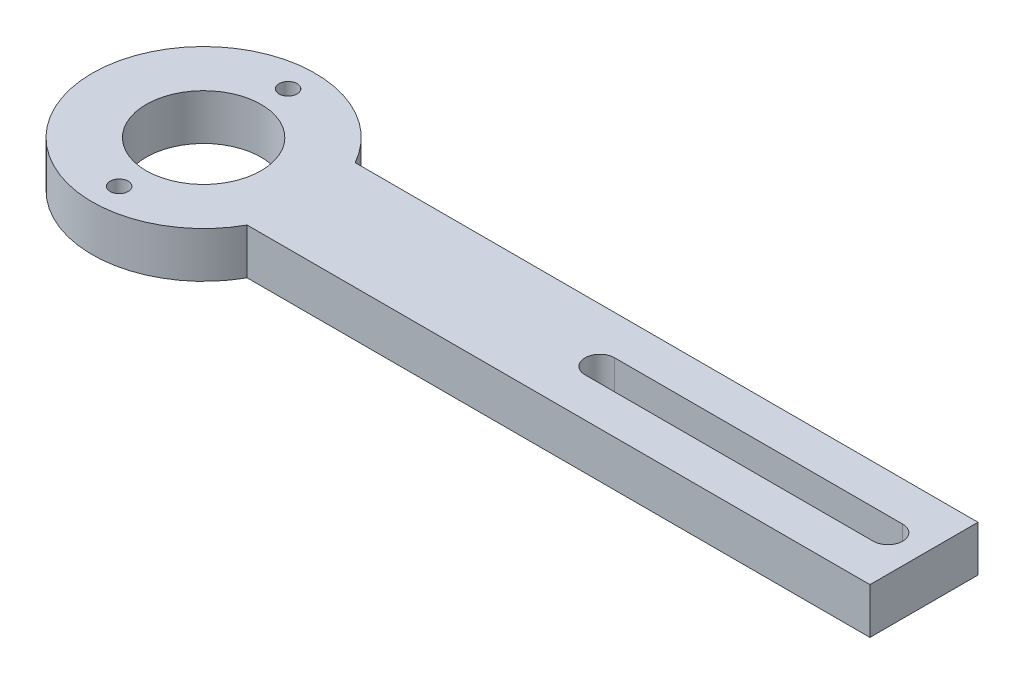
ISO-10303-21;
HEADER;
FILE_DESCRIPTION(('STEP AP214'),'2;1');
FILE_NAME('part.step','',(''),(''),'','','');
FILE_SCHEMA(('AUTOMOTIVE_DESIGN { 1 0 10303 214 1 1 1 1 }'));
ENDSEC;
DATA;
#1=APPLICATION_CONTEXT('core data for automotive mechanical design processes');
#2=APPLICATION_PROTOCOL_DEFINITION('international standard','automotive_design',2000,#1);
#3=PRODUCT_CONTEXT('',#1,'mechanical');
#4=PRODUCT('Part','Part','',(#3));
#5=PRODUCT_RELATED_PRODUCT_CATEGORY('part','',(#4));
#6=PRODUCT_DEFINITION_FORMATION('','',#4);
#7=PRODUCT_DEFINITION_CONTEXT('part definition',#1,'design');
#8=PRODUCT_DEFINITION('design','',#6,#7);
#9=PRODUCT_DEFINITION_SHAPE('','',#8);
#10=(LENGTH_UNIT() NAMED_UNIT(*) SI_UNIT(.MILLI.,.METRE.));
#11=(NAMED_UNIT(*) PLANE_ANGLE_UNIT() SI_UNIT($,.RADIAN.));
#12=(NAMED_UNIT(*) SI_UNIT($,.STERADIAN.) SOLID_ANGLE_UNIT());
#13=UNCERTAINTY_MEASURE_WITH_UNIT(LENGTH_MEASURE(1.E-05),#10,'distance_accuracy_value','');
#14=(GEOMETRIC_REPRESENTATION_CONTEXT(3) GLOBAL_UNCERTAINTY_ASSIGNED_CONTEXT((#13)) GLOBAL_UNIT_ASSIGNED_CONTEXT((#10,
#11,#12)) REPRESENTATION_CONTEXT('',''));
#15=CARTESIAN_POINT('',(0.,0.,0.));
#16=DIRECTION('',(0.,0.,1.));
#17=DIRECTION('',(1.,0.,0.));
#18=AXIS2_PLACEMENT_3D('',#15,#16,#17);
#19=CARTESIAN_POINT('',(0.,6.35,0.));
#20=DIRECTION('',(0.,1.,0.));
#21=DIRECTION('',(0.,0.,1.));
#22=AXIS2_PLACEMENT_3D('',#19,#20,#21);
#23=PLANE('',#22);
#24=CARTESIAN_POINT('',(0.,6.35,11.725));
#25=DIRECTION('',(0.,1.,0.));
#26=DIRECTION('',(0.,0.,1.));
#27=AXIS2_PLACEMENT_3D('',#24,#25,#26);
#28=CIRCLE('',#27,1.25);
#29=CARTESIAN_POINT('',(0.,6.35,12.975));
#30=VERTEX_POINT('',#29);
#31=EDGE_CURVE('E127',#30,#30,#28,.T.);
#32=ORIENTED_EDGE('',*,*,#31,.F.);
#33=EDGE_LOOP('',(#32));
#34=FACE_BOUND('',#33,.T.);
#35=CARTESIAN_POINT('',(0.,6.35,0.));
#36=DIRECTION('',(0.,1.,0.));
#37=DIRECTION('',(0.,0.,1.));
#38=AXIS2_PLACEMENT_3D('',#35,#36,#37);
#39=CIRCLE('',#38,15.475);
#40=CARTESIAN_POINT('',(13.5360860295729,6.35,-7.5));
#41=VERTEX_POINT('',#40);
#42=CARTESIAN_POINT('',(13.5360860295729,6.35,7.5));
#43=VERTEX_POINT('',#42);
#44=EDGE_CURVE('E143',#41,#43,#39,.T.);
#45=ORIENTED_EDGE('',*,*,#44,.T.);
#46=DIRECTION('',(1.,0.,0.));
#47=VECTOR('',#46,1.);
#48=CARTESIAN_POINT('',(100.,6.35,7.5));
#49=LINE('',#48,#47);
#50=CARTESIAN_POINT('',(100.,6.35,7.5));
#51=VERTEX_POINT('',#50);
#52=EDGE_CURVE('E146',#43,#51,#49,.T.);
#53=ORIENTED_EDGE('',*,*,#52,.T.);
#54=DIRECTION('',(0.,0.,-1.));
#55=VECTOR('',#54,1.);
#56=CARTESIAN_POINT('',(100.,6.35,-7.5));
#57=LINE('',#56,#55);
#58=CARTESIAN_POINT('',(100.,6.35,-7.5));
#59=VERTEX_POINT('',#58);
#60=EDGE_CURVE('E149',#51,#59,#57,.T.);
#61=ORIENTED_EDGE('',*,*,#60,.T.);
#62=DIRECTION('',(-1.,0.,0.));
#63=VECTOR('',#62,1.);
#64=CARTESIAN_POINT('',(13.5360860295729,6.35,-7.5));
#65=LINE('',#64,#63);
#66=EDGE_CURVE('E151',#59,#41,#65,.T.);
#67=ORIENTED_EDGE('',*,*,#66,.T.);
#68=EDGE_LOOP('',(#45,#53,#61,#67));
#69=FACE_BOUND('',#68,.T.);
#70=CARTESIAN_POINT('',(0.,6.35,0.));
#71=DIRECTION('',(0.,1.,0.));
#72=DIRECTION('',(0.,0.,1.));
#73=AXIS2_PLACEMENT_3D('',#70,#71,#72);
#74=CIRCLE('',#73,7.975);
#75=CARTESIAN_POINT('',(0.,6.35,7.975));
#76=VERTEX_POINT('',#75);
#77=EDGE_CURVE('E137',#76,#76,#74,.T.);
#78=ORIENTED_EDGE('',*,*,#77,.F.);
#79=EDGE_LOOP('',(#78));
#80=FACE_BOUND('',#79,.T.);
#81=DIRECTION('',(1.,0.,0.));
#82=VECTOR('',#81,1.);
#83=CARTESIAN_POINT('',(55.,6.35,2.05));
#84=LINE('',#83,#82);
#85=CARTESIAN_POINT('',(55.,6.35,2.05));
#86=VERTEX_POINT('',#85);
#87=CARTESIAN_POINT('',(95.,6.35,2.05));
#88=VERTEX_POINT('',#87);
#89=EDGE_CURVE('E106',#86,#88,#84,.T.);
#90=ORIENTED_EDGE('',*,*,#89,.F.);
#91=CARTESIAN_POINT('',(55.,6.35,0.));
#92=DIRECTION('',(0.,1.,0.));
#93=DIRECTION('',(0.,0.,1.));
#94=AXIS2_PLACEMENT_3D('',#91,#92,#93);
#95=CIRCLE('',#94,2.05);
#96=CARTESIAN_POINT('',(55.,6.35,-2.05));
#97=VERTEX_POINT('',#96);
#98=EDGE_CURVE('E98',#97,#86,#95,.T.);
#99=ORIENTED_EDGE('',*,*,#98,.F.);
#100=DIRECTION('',(-1.,0.,0.));
#101=VECTOR('',#100,1.);
#102=CARTESIAN_POINT('',(55.,6.35,-2.05));
#103=LINE('',#102,#101);
#104=CARTESIAN_POINT('',(95.,6.35,-2.05));
#105=VERTEX_POINT('',#104);
#106=EDGE_CURVE('E121',#105,#97,#103,.T.);
#107=ORIENTED_EDGE('',*,*,#106,.F.);
#108=CARTESIAN_POINT('',(95.,6.35,0.));
#109=DIRECTION('',(0.,1.,0.));
#110=DIRECTION('',(0.,0.,1.));
#111=AXIS2_PLACEMENT_3D('',#108,#109,#110);
#112=CIRCLE('',#111,2.05);
#113=EDGE_CURVE('E119',#88,#105,#112,.T.);
#114=ORIENTED_EDGE('',*,*,#113,.F.);
#115=EDGE_LOOP('',(#90,#99,#107,#114));
#116=FACE_BOUND('',#115,.T.);
#117=CARTESIAN_POINT('',(0.,6.35,-11.725));
#118=DIRECTION('',(0.,1.,0.));
#119=DIRECTION('',(0.,0.,1.));
#120=AXIS2_PLACEMENT_3D('',#117,#118,#119);
#121=CIRCLE('',#120,1.25);
#122=CARTESIAN_POINT('',(0.,6.35,-10.475));
#123=VERTEX_POINT('',#122);
#124=EDGE_CURVE('E242',#123,#123,#121,.T.);
#125=ORIENTED_EDGE('',*,*,#124,.F.);
#126=EDGE_LOOP('',(#125));
#127=FACE_BOUND('',#126,.T.);
#128=ADVANCED_FACE('F33',(#34,#69,#80,#116,#127),#23,.T.);
#129=CARTESIAN_POINT('',(0.,0.,0.));
#130=DIRECTION('',(0.,1.,0.));
#131=DIRECTION('',(0.,0.,1.));
#132=AXIS2_PLACEMENT_3D('',#129,#130,#131);
#133=PLANE('',#132);
#134=CARTESIAN_POINT('',(0.,0.,0.));
#135=DIRECTION('',(0.,1.,0.));
#136=DIRECTION('',(0.,0.,1.));
#137=AXIS2_PLACEMENT_3D('',#134,#135,#136);
#138=CIRCLE('',#137,7.975);
#139=CARTESIAN_POINT('',(0.,0.,7.975));
#140=VERTEX_POINT('',#139);
#141=EDGE_CURVE('E114',#140,#140,#138,.T.);
#142=ORIENTED_EDGE('',*,*,#141,.T.);
#143=EDGE_LOOP('',(#142));
#144=FACE_BOUND('',#143,.T.);
#145=CARTESIAN_POINT('',(0.,0.,0.));
#146=DIRECTION('',(0.,1.,0.));
#147=DIRECTION('',(0.,0.,1.));
#148=AXIS2_PLACEMENT_3D('',#145,#146,#147);
#149=CIRCLE('',#148,15.475);
#150=CARTESIAN_POINT('',(13.5360860295729,0.,-7.5));
#151=VERTEX_POINT('',#150);
#152=CARTESIAN_POINT('',(13.5360860295729,0.,7.5));
#153=VERTEX_POINT('',#152);
#154=EDGE_CURVE('E140',#151,#153,#149,.T.);
#155=ORIENTED_EDGE('',*,*,#154,.F.);
#156=DIRECTION('',(-1.,0.,0.));
#157=VECTOR('',#156,1.);
#158=CARTESIAN_POINT('',(13.5360860295729,0.,-7.5));
#159=LINE('',#158,#157);
#160=CARTESIAN_POINT('',(100.,0.,-7.5));
#161=VERTEX_POINT('',#160);
#162=EDGE_CURVE('E147',#161,#151,#159,.T.);
#163=ORIENTED_EDGE('',*,*,#162,.F.);
#164=DIRECTION('',(0.,0.,-1.));
#165=VECTOR('',#164,1.);
#166=CARTESIAN_POINT('',(100.,0.,-7.5));
#167=LINE('',#166,#165);
#168=CARTESIAN_POINT('',(100.,0.,7.5));
#169=VERTEX_POINT('',#168);
#170=EDGE_CURVE('E158',#169,#161,#167,.T.);
#171=ORIENTED_EDGE('',*,*,#170,.F.);
#172=DIRECTION('',(1.,0.,0.));
#173=VECTOR('',#172,1.);
#174=CARTESIAN_POINT('',(100.,0.,7.5));
#175=LINE('',#174,#173);
#176=EDGE_CURVE('E156',#153,#169,#175,.T.);
#177=ORIENTED_EDGE('',*,*,#176,.F.);
#178=EDGE_LOOP('',(#155,#163,#171,#177));
#179=FACE_BOUND('',#178,.T.);
#180=CARTESIAN_POINT('',(55.,0.,0.));
#181=DIRECTION('',(0.,1.,0.));
#182=DIRECTION('',(0.,0.,1.));
#183=AXIS2_PLACEMENT_3D('',#180,#181,#182);
#184=CIRCLE('',#183,2.05);
#185=CARTESIAN_POINT('',(55.,0.,-2.05));
#186=VERTEX_POINT('',#185);
#187=CARTESIAN_POINT('',(55.,0.,2.05));
#188=VERTEX_POINT('',#187);
#189=EDGE_CURVE('E56',#186,#188,#184,.T.);
#190=ORIENTED_EDGE('',*,*,#189,.T.);
#191=DIRECTION('',(1.,0.,0.));
#192=VECTOR('',#191,1.);
#193=CARTESIAN_POINT('',(55.,0.,2.05));
#194=LINE('',#193,#192);
#195=CARTESIAN_POINT('',(95.,0.,2.05));
#196=VERTEX_POINT('',#195);
#197=EDGE_CURVE('E113',#188,#196,#194,.T.);
#198=ORIENTED_EDGE('',*,*,#197,.T.);
#199=CARTESIAN_POINT('',(95.,0.,0.));
#200=DIRECTION('',(0.,1.,0.));
#201=DIRECTION('',(0.,0.,1.));
#202=AXIS2_PLACEMENT_3D('',#199,#200,#201);
#203=CIRCLE('',#202,2.05);
#204=CARTESIAN_POINT('',(95.,0.,-2.05));
#205=VERTEX_POINT('',#204);
#206=EDGE_CURVE('E129',#196,#205,#203,.T.);
#207=ORIENTED_EDGE('',*,*,#206,.T.);
#208=DIRECTION('',(-1.,0.,0.));
#209=VECTOR('',#208,1.);
#210=CARTESIAN_POINT('',(55.,0.,-2.05));
#211=LINE('',#210,#209);
#212=EDGE_CURVE('E107',#205,#186,#211,.T.);
#213=ORIENTED_EDGE('',*,*,#212,.T.);
#214=EDGE_LOOP('',(#190,#198,#207,#213));
#215=FACE_BOUND('',#214,.T.);
#216=CARTESIAN_POINT('',(0.,0.,11.725));
#217=DIRECTION('',(0.,1.,0.));
#218=DIRECTION('',(0.,0.,1.));
#219=AXIS2_PLACEMENT_3D('',#216,#217,#218);
#220=CIRCLE('',#219,1.25);
#221=CARTESIAN_POINT('',(0.,0.,12.975));
#222=VERTEX_POINT('',#221);
#223=EDGE_CURVE('E248',#222,#222,#220,.T.);
#224=ORIENTED_EDGE('',*,*,#223,.T.);
#225=EDGE_LOOP('',(#224));
#226=FACE_BOUND('',#225,.T.);
#227=CARTESIAN_POINT('',(0.,0.,-11.725));
#228=DIRECTION('',(0.,1.,0.));
#229=DIRECTION('',(0.,0.,1.));
#230=AXIS2_PLACEMENT_3D('',#227,#228,#229);
#231=CIRCLE('',#230,1.25);
#232=CARTESIAN_POINT('',(0.,0.,-10.475));
#233=VERTEX_POINT('',#232);
#234=EDGE_CURVE('E245',#233,#233,#231,.T.);
#235=ORIENTED_EDGE('',*,*,#234,.T.);
#236=EDGE_LOOP('',(#235));
#237=FACE_BOUND('',#236,.T.);
#238=ADVANCED_FACE('F176',(#144,#179,#215,#226,#237),#133,.F.);
#239=CARTESIAN_POINT('',(0.,6.35,0.));
#240=DIRECTION('',(0.,-1.,0.));
#241=DIRECTION('',(0.,0.,-1.));
#242=AXIS2_PLACEMENT_3D('',#239,#240,#241);
#243=CYLINDRICAL_SURFACE('',#242,15.475);
#244=ORIENTED_EDGE('',*,*,#154,.T.);
#245=DIRECTION('',(0.,-1.,0.));
#246=VECTOR('',#245,1.);
#247=CARTESIAN_POINT('',(13.5360860295729,6.35,7.5));
#248=LINE('',#247,#246);
#249=EDGE_CURVE('E11',#43,#153,#248,.T.);
#250=ORIENTED_EDGE('',*,*,#249,.F.);
#251=ORIENTED_EDGE('',*,*,#44,.F.);
#252=DIRECTION('',(0.,-1.,0.));
#253=VECTOR('',#252,1.);
#254=CARTESIAN_POINT('',(13.5360860295729,6.35,-7.5));
#255=LINE('',#254,#253);
#256=EDGE_CURVE('E153',#41,#151,#255,.T.);
#257=ORIENTED_EDGE('',*,*,#256,.T.);
#258=EDGE_LOOP('',(#244,#250,#251,#257));
#259=FACE_BOUND('',#258,.T.);
#260=ADVANCED_FACE('F35',(#259),#243,.T.);
#261=CARTESIAN_POINT('',(100.,6.35,7.5));
#262=DIRECTION('',(0.,0.,-1.));
#263=DIRECTION('',(-1.,0.,0.));
#264=AXIS2_PLACEMENT_3D('',#261,#262,#263);
#265=PLANE('',#264);
#266=ORIENTED_EDGE('',*,*,#176,.T.);
#267=DIRECTION('',(0.,-1.,0.));
#268=VECTOR('',#267,1.);
#269=CARTESIAN_POINT('',(100.,6.35,7.5));
#270=LINE('',#269,#268);
#271=EDGE_CURVE('E41',#51,#169,#270,.T.);
#272=ORIENTED_EDGE('',*,*,#271,.F.);
#273=ORIENTED_EDGE('',*,*,#52,.F.);
#274=ORIENTED_EDGE('',*,*,#249,.T.);
#275=EDGE_LOOP('',(#266,#272,#273,#274));
#276=FACE_BOUND('',#275,.T.);
#277=ADVANCED_FACE('F187',(#276),#265,.F.);
#278=CARTESIAN_POINT('',(100.,6.35,-7.5));
#279=DIRECTION('',(-1.,0.,0.));
#280=DIRECTION('',(0.,0.,1.));
#281=AXIS2_PLACEMENT_3D('',#278,#279,#280);
#282=PLANE('',#281);
#283=ORIENTED_EDGE('',*,*,#170,.T.);
#284=DIRECTION('',(0.,-1.,0.));
#285=VECTOR('',#284,1.);
#286=CARTESIAN_POINT('',(100.,6.35,-7.5));
#287=LINE('',#286,#285);
#288=EDGE_CURVE('E163',#59,#161,#287,.T.);
#289=ORIENTED_EDGE('',*,*,#288,.F.);
#290=ORIENTED_EDGE('',*,*,#60,.F.);
#291=ORIENTED_EDGE('',*,*,#271,.T.);
#292=EDGE_LOOP('',(#283,#289,#290,#291));
#293=FACE_BOUND('',#292,.T.);
#294=ADVANCED_FACE('F170',(#293),#282,.F.);
#295=CARTESIAN_POINT('',(13.5360860295729,6.35,-7.5));
#296=DIRECTION('',(0.,0.,1.));
#297=DIRECTION('',(1.,0.,0.));
#298=AXIS2_PLACEMENT_3D('',#295,#296,#297);
#299=PLANE('',#298);
#300=ORIENTED_EDGE('',*,*,#162,.T.);
#301=ORIENTED_EDGE('',*,*,#256,.F.);
#302=ORIENTED_EDGE('',*,*,#66,.F.);
#303=ORIENTED_EDGE('',*,*,#288,.T.);
#304=EDGE_LOOP('',(#300,#301,#302,#303));
#305=FACE_BOUND('',#304,.T.);
#306=ADVANCED_FACE('F180',(#305),#299,.F.);
#307=CARTESIAN_POINT('',(0.,6.35,0.));
#308=DIRECTION('',(0.,-1.,0.));
#309=DIRECTION('',(0.,0.,-1.));
#310=AXIS2_PLACEMENT_3D('',#307,#308,#309);
#311=CYLINDRICAL_SURFACE('',#310,7.975);
#312=ORIENTED_EDGE('',*,*,#77,.T.);
#313=EDGE_LOOP('',(#312));
#314=FACE_BOUND('',#313,.T.);
#315=ORIENTED_EDGE('',*,*,#141,.F.);
#316=EDGE_LOOP('',(#315));
#317=FACE_BOUND('',#316,.T.);
#318=ADVANCED_FACE('F204',(#314,#317),#311,.F.);
#319=CARTESIAN_POINT('',(55.,6.35,0.));
#320=DIRECTION('',(0.,-1.,0.));
#321=DIRECTION('',(0.,0.,-1.));
#322=AXIS2_PLACEMENT_3D('',#319,#320,#321);
#323=CYLINDRICAL_SURFACE('',#322,2.05);
#324=ORIENTED_EDGE('',*,*,#189,.F.);
#325=DIRECTION('',(0.,-1.,0.));
#326=VECTOR('',#325,1.);
#327=CARTESIAN_POINT('',(55.,6.35,-2.05));
#328=LINE('',#327,#326);
#329=EDGE_CURVE('E102',#97,#186,#328,.T.);
#330=ORIENTED_EDGE('',*,*,#329,.F.);
#331=ORIENTED_EDGE('',*,*,#98,.T.);
#332=DIRECTION('',(0.,-1.,0.));
#333=VECTOR('',#332,1.);
#334=CARTESIAN_POINT('',(55.,6.35,2.05));
#335=LINE('',#334,#333);
#336=EDGE_CURVE('E101',#86,#188,#335,.T.);
#337=ORIENTED_EDGE('',*,*,#336,.T.);
#338=EDGE_LOOP('',(#324,#330,#331,#337));
#339=FACE_BOUND('',#338,.T.);
#340=ADVANCED_FACE('F100',(#339),#323,.F.);
#341=CARTESIAN_POINT('',(55.,6.35,2.05));
#342=DIRECTION('',(0.,0.,-1.));
#343=DIRECTION('',(-1.,0.,0.));
#344=AXIS2_PLACEMENT_3D('',#341,#342,#343);
#345=PLANE('',#344);
#346=ORIENTED_EDGE('',*,*,#197,.F.);
#347=ORIENTED_EDGE('',*,*,#336,.F.);
#348=ORIENTED_EDGE('',*,*,#89,.T.);
#349=DIRECTION('',(0.,-1.,0.));
#350=VECTOR('',#349,1.);
#351=CARTESIAN_POINT('',(95.,6.35,2.05));
#352=LINE('',#351,#350);
#353=EDGE_CURVE('E115',#88,#196,#352,.T.);
#354=ORIENTED_EDGE('',*,*,#353,.T.);
#355=EDGE_LOOP('',(#346,#347,#348,#354));
#356=FACE_BOUND('',#355,.T.);
#357=ADVANCED_FACE('F110',(#356),#345,.T.);
#358=CARTESIAN_POINT('',(95.,6.35,0.));
#359=DIRECTION('',(0.,-1.,0.));
#360=DIRECTION('',(0.,0.,-1.));
#361=AXIS2_PLACEMENT_3D('',#358,#359,#360);
#362=CYLINDRICAL_SURFACE('',#361,2.05);
#363=ORIENTED_EDGE('',*,*,#206,.F.);
#364=ORIENTED_EDGE('',*,*,#353,.F.);
#365=ORIENTED_EDGE('',*,*,#113,.T.);
#366=DIRECTION('',(0.,-1.,0.));
#367=VECTOR('',#366,1.);
#368=CARTESIAN_POINT('',(95.,6.35,-2.05));
#369=LINE('',#368,#367);
#370=EDGE_CURVE('E48',#105,#205,#369,.T.);
#371=ORIENTED_EDGE('',*,*,#370,.T.);
#372=EDGE_LOOP('',(#363,#364,#365,#371));
#373=FACE_BOUND('',#372,.T.);
#374=ADVANCED_FACE('F221',(#373),#362,.F.);
#375=CARTESIAN_POINT('',(55.,6.35,-2.05));
#376=DIRECTION('',(0.,0.,1.));
#377=DIRECTION('',(1.,0.,0.));
#378=AXIS2_PLACEMENT_3D('',#375,#376,#377);
#379=PLANE('',#378);
#380=ORIENTED_EDGE('',*,*,#212,.F.);
#381=ORIENTED_EDGE('',*,*,#370,.F.);
#382=ORIENTED_EDGE('',*,*,#106,.T.);
#383=ORIENTED_EDGE('',*,*,#329,.T.);
#384=EDGE_LOOP('',(#380,#381,#382,#383));
#385=FACE_BOUND('',#384,.T.);
#386=ADVANCED_FACE('F226',(#385),#379,.T.);
#387=CARTESIAN_POINT('',(0.,6.35,11.725));
#388=DIRECTION('',(0.,-1.,0.));
#389=DIRECTION('',(0.,0.,-1.));
#390=AXIS2_PLACEMENT_3D('',#387,#388,#389);
#391=CYLINDRICAL_SURFACE('',#390,1.25);
#392=ORIENTED_EDGE('',*,*,#31,.T.);
#393=EDGE_LOOP('',(#392));
#394=FACE_BOUND('',#393,.T.);
#395=ORIENTED_EDGE('',*,*,#223,.F.);
#396=EDGE_LOOP('',(#395));
#397=FACE_BOUND('',#396,.T.);
#398=ADVANCED_FACE('F230',(#394,#397),#391,.F.);
#399=CARTESIAN_POINT('',(0.,6.35,-11.725));
#400=DIRECTION('',(0.,-1.,0.));
#401=DIRECTION('',(0.,0.,-1.));
#402=AXIS2_PLACEMENT_3D('',#399,#400,#401);
#403=CYLINDRICAL_SURFACE('',#402,1.25);
#404=ORIENTED_EDGE('',*,*,#124,.T.);
#405=EDGE_LOOP('',(#404));
#406=FACE_BOUND('',#405,.T.);
#407=ORIENTED_EDGE('',*,*,#234,.F.);
#408=EDGE_LOOP('',(#407));
#409=FACE_BOUND('',#408,.T.);
#410=ADVANCED_FACE('F233',(#406,#409),#403,.F.);
#411=CLOSED_SHELL('',(#128,#238,#260,#277,#294,#306,#318,#340,#357,#374,#386,#398,#410));
#412=MANIFOLD_SOLID_BREP('B2',#411);
#413=ADVANCED_BREP_SHAPE_REPRESENTATION('',(#18,#412),#14);
#414=SHAPE_DEFINITION_REPRESENTATION(#9,#413);
ENDSEC;
END-ISO-10303-21;
